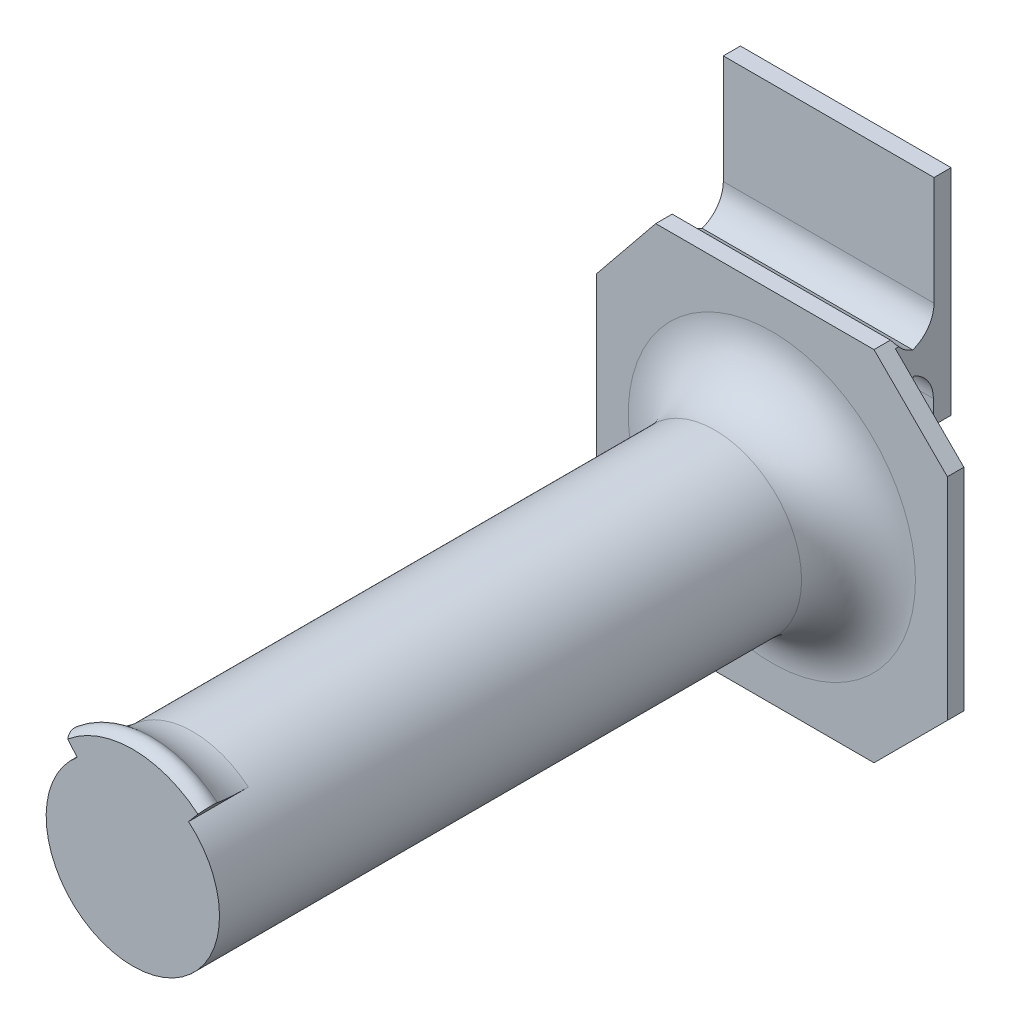
ISO-10303-21;
HEADER;
FILE_DESCRIPTION(('STEP AP214'),'2;1');
FILE_NAME('part.step','',(''),(''),'','','');
FILE_SCHEMA(('AUTOMOTIVE_DESIGN { 1 0 10303 214 1 1 1 1 }'));
ENDSEC;
DATA;
#1=APPLICATION_CONTEXT('core data for automotive mechanical design processes');
#2=APPLICATION_PROTOCOL_DEFINITION('international standard','automotive_design',2000,#1);
#3=PRODUCT_CONTEXT('',#1,'mechanical');
#4=PRODUCT('Part','Part','',(#3));
#5=PRODUCT_RELATED_PRODUCT_CATEGORY('part','',(#4));
#6=PRODUCT_DEFINITION_FORMATION('','',#4);
#7=PRODUCT_DEFINITION_CONTEXT('part definition',#1,'design');
#8=PRODUCT_DEFINITION('design','',#6,#7);
#9=PRODUCT_DEFINITION_SHAPE('','',#8);
#10=(LENGTH_UNIT() NAMED_UNIT(*) SI_UNIT(.MILLI.,.METRE.));
#11=(NAMED_UNIT(*) PLANE_ANGLE_UNIT() SI_UNIT($,.RADIAN.));
#12=(NAMED_UNIT(*) SI_UNIT($,.STERADIAN.) SOLID_ANGLE_UNIT());
#13=UNCERTAINTY_MEASURE_WITH_UNIT(LENGTH_MEASURE(1.E-05),#10,'distance_accuracy_value','');
#14=(GEOMETRIC_REPRESENTATION_CONTEXT(3) GLOBAL_UNCERTAINTY_ASSIGNED_CONTEXT((#13)) GLOBAL_UNIT_ASSIGNED_CONTEXT((#10,
#11,#12)) REPRESENTATION_CONTEXT('',''));
#15=CARTESIAN_POINT('',(0.,0.,0.));
#16=DIRECTION('',(0.,0.,1.));
#17=DIRECTION('',(1.,0.,0.));
#18=AXIS2_PLACEMENT_3D('',#15,#16,#17);
#19=CARTESIAN_POINT('',(0.,0.,0.));
#20=DIRECTION('',(0.,0.,1.));
#21=DIRECTION('',(1.,0.,0.));
#22=AXIS2_PLACEMENT_3D('',#19,#20,#21);
#23=PLANE('',#22);
#24=CARTESIAN_POINT('',(0.,0.,0.));
#25=DIRECTION('',(0.,0.,1.));
#26=DIRECTION('',(1.,0.,0.));
#27=AXIS2_PLACEMENT_3D('',#24,#25,#26);
#28=CIRCLE('',#27,22.7);
#29=CARTESIAN_POINT('',(22.7,0.,0.));
#30=VERTEX_POINT('',#29);
#31=EDGE_CURVE('E11',#30,#30,#28,.F.);
#32=ORIENTED_EDGE('',*,*,#31,.T.);
#33=EDGE_LOOP('',(#32));
#34=FACE_BOUND('',#33,.T.);
#35=DIRECTION('',(0.,-1.,0.));
#36=VECTOR('',#35,1.);
#37=CARTESIAN_POINT('',(27.75,28.280672501964,0.));
#38=LINE('',#37,#36);
#39=CARTESIAN_POINT('',(27.75,16.6806725019641,0.));
#40=VERTEX_POINT('',#39);
#41=CARTESIAN_POINT('',(27.75,-16.6806725019641,0.));
#42=VERTEX_POINT('',#41);
#43=EDGE_CURVE('E445',#40,#42,#38,.T.);
#44=ORIENTED_EDGE('',*,*,#43,.F.);
#45=DIRECTION('',(0.707106781186551,-0.707106781186544,0.));
#46=VECTOR('',#45,1.);
#47=CARTESIAN_POINT('',(16.15,28.280672501964,0.));
#48=LINE('',#47,#46);
#49=CARTESIAN_POINT('',(16.15,28.280672501964,0.));
#50=VERTEX_POINT('',#49);
#51=EDGE_CURVE('E392',#50,#40,#48,.T.);
#52=ORIENTED_EDGE('',*,*,#51,.F.);
#53=DIRECTION('',(1.,0.,0.));
#54=VECTOR('',#53,1.);
#55=CARTESIAN_POINT('',(-27.75,28.280672501964,0.));
#56=LINE('',#55,#54);
#57=CARTESIAN_POINT('',(-18.35,28.280672501964,0.));
#58=VERTEX_POINT('',#57);
#59=EDGE_CURVE('E433',#58,#50,#56,.T.);
#60=ORIENTED_EDGE('',*,*,#59,.F.);
#61=DIRECTION('',(0.629583498277007,0.77693282766098,0.));
#62=VECTOR('',#61,1.);
#63=CARTESIAN_POINT('',(-24.9098354997943,20.1855563532818,0.));
#64=LINE('',#63,#62);
#65=CARTESIAN_POINT('',(-27.75,16.6806725019641,0.));
#66=VERTEX_POINT('',#65);
#67=EDGE_CURVE('E419',#66,#58,#64,.T.);
#68=ORIENTED_EDGE('',*,*,#67,.F.);
#69=DIRECTION('',(0.,-1.,0.));
#70=VECTOR('',#69,1.);
#71=CARTESIAN_POINT('',(-27.75,28.280672501964,0.));
#72=LINE('',#71,#70);
#73=CARTESIAN_POINT('',(-27.75,-18.8806725019639,0.));
#74=VERTEX_POINT('',#73);
#75=EDGE_CURVE('E426',#66,#74,#72,.T.);
#76=ORIENTED_EDGE('',*,*,#75,.T.);
#77=DIRECTION('',(-0.707106781186545,0.70710678118655,0.));
#78=VECTOR('',#77,1.);
#79=CARTESIAN_POINT('',(-23.315336250982,-23.3153362509819,0.));
#80=LINE('',#79,#78);
#81=CARTESIAN_POINT('',(-18.35,-28.280672501964,0.));
#82=VERTEX_POINT('',#81);
#83=EDGE_CURVE('E400',#82,#74,#80,.T.);
#84=ORIENTED_EDGE('',*,*,#83,.F.);
#85=DIRECTION('',(1.,0.,0.));
#86=VECTOR('',#85,1.);
#87=CARTESIAN_POINT('',(-27.75,-28.280672501964,0.));
#88=LINE('',#87,#86);
#89=CARTESIAN_POINT('',(16.15,-28.280672501964,0.));
#90=VERTEX_POINT('',#89);
#91=EDGE_CURVE('E443',#82,#90,#88,.T.);
#92=ORIENTED_EDGE('',*,*,#91,.T.);
#93=DIRECTION('',(0.707106781186551,0.707106781186544,0.));
#94=VECTOR('',#93,1.);
#95=CARTESIAN_POINT('',(22.2153362509819,-22.2153362509821,0.));
#96=LINE('',#95,#94);
#97=EDGE_CURVE('E410',#90,#42,#96,.T.);
#98=ORIENTED_EDGE('',*,*,#97,.T.);
#99=EDGE_LOOP('',(#44,#52,#60,#68,#76,#84,#92,#98));
#100=FACE_BOUND('',#99,.T.);
#101=ADVANCED_FACE('F35',(#34,#100),#23,.T.);
#102=CARTESIAN_POINT('',(0.,0.,-2.6));
#103=DIRECTION('',(0.,0.,1.));
#104=DIRECTION('',(1.,0.,0.));
#105=AXIS2_PLACEMENT_3D('',#102,#103,#104);
#106=PLANE('',#105);
#107=DIRECTION('',(1.,0.,0.));
#108=VECTOR('',#107,1.);
#109=CARTESIAN_POINT('',(-27.75,28.280672501964,-2.6));
#110=LINE('',#109,#108);
#111=CARTESIAN_POINT('',(-18.35,28.280672501964,-2.6));
#112=VERTEX_POINT('',#111);
#113=CARTESIAN_POINT('',(-16.3666459952623,28.280672501964,-2.6));
#114=VERTEX_POINT('',#113);
#115=EDGE_CURVE('E438',#112,#114,#110,.T.);
#116=ORIENTED_EDGE('',*,*,#115,.T.);
#117=DIRECTION('',(0.,-1.,0.));
#118=VECTOR('',#117,1.);
#119=CARTESIAN_POINT('',(-16.3666459952623,25.680672501964,-2.6));
#120=LINE('',#119,#118);
#121=CARTESIAN_POINT('',(-16.3666459952623,17.680672501964,-2.6));
#122=VERTEX_POINT('',#121);
#123=EDGE_CURVE('E364',#114,#122,#120,.T.);
#124=ORIENTED_EDGE('',*,*,#123,.T.);
#125=DIRECTION('',(1.,0.,0.));
#126=VECTOR('',#125,1.);
#127=CARTESIAN_POINT('',(0.,17.680672501964,-2.6));
#128=LINE('',#127,#126);
#129=CARTESIAN_POINT('',(16.9333540047377,17.680672501964,-2.6));
#130=VERTEX_POINT('',#129);
#131=EDGE_CURVE('E260',#122,#130,#128,.T.);
#132=ORIENTED_EDGE('',*,*,#131,.T.);
#133=DIRECTION('',(0.,1.,0.));
#134=VECTOR('',#133,1.);
#135=CARTESIAN_POINT('',(16.9333540047377,22.680672501964,-2.6));
#136=LINE('',#135,#134);
#137=CARTESIAN_POINT('',(16.9333540047377,27.4973184972263,-2.6));
#138=VERTEX_POINT('',#137);
#139=EDGE_CURVE('E383',#130,#138,#136,.T.);
#140=ORIENTED_EDGE('',*,*,#139,.T.);
#141=DIRECTION('',(0.707106781186551,-0.707106781186544,0.));
#142=VECTOR('',#141,1.);
#143=CARTESIAN_POINT('',(16.15,28.280672501964,-2.6));
#144=LINE('',#143,#142);
#145=CARTESIAN_POINT('',(27.75,16.6806725019641,-2.6));
#146=VERTEX_POINT('',#145);
#147=EDGE_CURVE('E393',#138,#146,#144,.T.);
#148=ORIENTED_EDGE('',*,*,#147,.T.);
#149=DIRECTION('',(0.,-1.,0.));
#150=VECTOR('',#149,1.);
#151=CARTESIAN_POINT('',(27.75,28.280672501964,-2.6));
#152=LINE('',#151,#150);
#153=CARTESIAN_POINT('',(27.75,-16.6806725019641,-2.6));
#154=VERTEX_POINT('',#153);
#155=EDGE_CURVE('E435',#146,#154,#152,.T.);
#156=ORIENTED_EDGE('',*,*,#155,.T.);
#157=DIRECTION('',(0.707106781186551,0.707106781186544,0.));
#158=VECTOR('',#157,1.);
#159=CARTESIAN_POINT('',(22.2153362509819,-22.2153362509821,-2.6));
#160=LINE('',#159,#158);
#161=CARTESIAN_POINT('',(16.15,-28.280672501964,-2.6));
#162=VERTEX_POINT('',#161);
#163=EDGE_CURVE('E413',#162,#154,#160,.T.);
#164=ORIENTED_EDGE('',*,*,#163,.F.);
#165=DIRECTION('',(1.,0.,0.));
#166=VECTOR('',#165,1.);
#167=CARTESIAN_POINT('',(-27.75,-28.280672501964,-2.6));
#168=LINE('',#167,#166);
#169=CARTESIAN_POINT('',(-18.35,-28.280672501964,-2.6));
#170=VERTEX_POINT('',#169);
#171=EDGE_CURVE('E432',#170,#162,#168,.T.);
#172=ORIENTED_EDGE('',*,*,#171,.F.);
#173=DIRECTION('',(-0.707106781186545,0.70710678118655,0.));
#174=VECTOR('',#173,1.);
#175=CARTESIAN_POINT('',(-23.315336250982,-23.3153362509819,-2.6));
#176=LINE('',#175,#174);
#177=CARTESIAN_POINT('',(-27.75,-18.8806725019639,-2.6));
#178=VERTEX_POINT('',#177);
#179=EDGE_CURVE('E402',#170,#178,#176,.T.);
#180=ORIENTED_EDGE('',*,*,#179,.T.);
#181=DIRECTION('',(0.,-1.,0.));
#182=VECTOR('',#181,1.);
#183=CARTESIAN_POINT('',(-27.75,28.280672501964,-2.6));
#184=LINE('',#183,#182);
#185=CARTESIAN_POINT('',(-27.75,16.6806725019641,-2.6));
#186=VERTEX_POINT('',#185);
#187=EDGE_CURVE('E429',#186,#178,#184,.T.);
#188=ORIENTED_EDGE('',*,*,#187,.F.);
#189=DIRECTION('',(0.629583498277007,0.77693282766098,0.));
#190=VECTOR('',#189,1.);
#191=CARTESIAN_POINT('',(-24.9098354997943,20.1855563532818,-2.6));
#192=LINE('',#191,#190);
#193=EDGE_CURVE('E416',#186,#112,#192,.T.);
#194=ORIENTED_EDGE('',*,*,#193,.T.);
#195=EDGE_LOOP('',(#116,#124,#132,#140,#148,#156,#164,#172,#180,#188,#194));
#196=FACE_BOUND('',#195,.T.);
#197=ADVANCED_FACE('F305',(#196),#106,.F.);
#198=CARTESIAN_POINT('',(-27.75,28.280672501964,-2.6));
#199=DIRECTION('',(0.,-1.,0.));
#200=DIRECTION('',(1.,0.,0.));
#201=AXIS2_PLACEMENT_3D('',#198,#199,#200);
#202=PLANE('',#201);
#203=DIRECTION('',(0.,0.,-1.));
#204=VECTOR('',#203,1.);
#205=CARTESIAN_POINT('',(16.15,28.280672501964,0.));
#206=LINE('',#205,#204);
#207=CARTESIAN_POINT('',(16.15,28.280672501964,-2.6));
#208=VERTEX_POINT('',#207);
#209=EDGE_CURVE('E387',#50,#208,#206,.T.);
#210=ORIENTED_EDGE('',*,*,#209,.T.);
#211=EDGE_CURVE('E437',#114,#208,#110,.T.);
#212=ORIENTED_EDGE('',*,*,#211,.F.);
#213=ORIENTED_EDGE('',*,*,#115,.F.);
#214=DIRECTION('',(0.,0.,-1.));
#215=VECTOR('',#214,1.);
#216=CARTESIAN_POINT('',(-18.35,28.280672501964,0.));
#217=LINE('',#216,#215);
#218=EDGE_CURVE('E424',#58,#112,#217,.T.);
#219=ORIENTED_EDGE('',*,*,#218,.F.);
#220=ORIENTED_EDGE('',*,*,#59,.T.);
#221=EDGE_LOOP('',(#210,#212,#213,#219,#220));
#222=FACE_BOUND('',#221,.T.);
#223=ADVANCED_FACE('F311',(#222),#202,.F.);
#224=CARTESIAN_POINT('',(27.75,28.280672501964,-2.6));
#225=DIRECTION('',(-1.,0.,0.));
#226=DIRECTION('',(0.,-1.,0.));
#227=AXIS2_PLACEMENT_3D('',#224,#225,#226);
#228=PLANE('',#227);
#229=DIRECTION('',(0.,0.,-1.));
#230=VECTOR('',#229,1.);
#231=CARTESIAN_POINT('',(27.75,16.6806725019641,0.));
#232=LINE('',#231,#230);
#233=EDGE_CURVE('E385',#40,#146,#232,.T.);
#234=ORIENTED_EDGE('',*,*,#233,.F.);
#235=ORIENTED_EDGE('',*,*,#43,.T.);
#236=DIRECTION('',(0.,0.,-1.));
#237=VECTOR('',#236,1.);
#238=CARTESIAN_POINT('',(27.75,-16.6806725019641,0.));
#239=LINE('',#238,#237);
#240=EDGE_CURVE('E405',#42,#154,#239,.T.);
#241=ORIENTED_EDGE('',*,*,#240,.T.);
#242=ORIENTED_EDGE('',*,*,#155,.F.);
#243=EDGE_LOOP('',(#234,#235,#241,#242));
#244=FACE_BOUND('',#243,.T.);
#245=ADVANCED_FACE('F319',(#244),#228,.F.);
#246=CARTESIAN_POINT('',(-27.75,28.280672501964,-2.6));
#247=DIRECTION('',(-1.,0.,0.));
#248=DIRECTION('',(0.,-1.,0.));
#249=AXIS2_PLACEMENT_3D('',#246,#247,#248);
#250=PLANE('',#249);
#251=ORIENTED_EDGE('',*,*,#187,.T.);
#252=DIRECTION('',(0.,0.,-1.));
#253=VECTOR('',#252,1.);
#254=CARTESIAN_POINT('',(-27.75,-18.8806725019639,0.));
#255=LINE('',#254,#253);
#256=EDGE_CURVE('E395',#74,#178,#255,.T.);
#257=ORIENTED_EDGE('',*,*,#256,.F.);
#258=ORIENTED_EDGE('',*,*,#75,.F.);
#259=DIRECTION('',(0.,0.,-1.));
#260=VECTOR('',#259,1.);
#261=CARTESIAN_POINT('',(-27.75,16.6806725019641,0.));
#262=LINE('',#261,#260);
#263=EDGE_CURVE('E421',#66,#186,#262,.T.);
#264=ORIENTED_EDGE('',*,*,#263,.T.);
#265=EDGE_LOOP('',(#251,#257,#258,#264));
#266=FACE_BOUND('',#265,.T.);
#267=ADVANCED_FACE('F323',(#266),#250,.T.);
#268=CARTESIAN_POINT('',(-27.75,-28.280672501964,-2.6));
#269=DIRECTION('',(0.,-1.,0.));
#270=DIRECTION('',(1.,0.,0.));
#271=AXIS2_PLACEMENT_3D('',#268,#269,#270);
#272=PLANE('',#271);
#273=ORIENTED_EDGE('',*,*,#91,.F.);
#274=DIRECTION('',(0.,0.,-1.));
#275=VECTOR('',#274,1.);
#276=CARTESIAN_POINT('',(-18.35,-28.280672501964,0.));
#277=LINE('',#276,#275);
#278=EDGE_CURVE('E397',#82,#170,#277,.T.);
#279=ORIENTED_EDGE('',*,*,#278,.T.);
#280=ORIENTED_EDGE('',*,*,#171,.T.);
#281=DIRECTION('',(0.,0.,-1.));
#282=VECTOR('',#281,1.);
#283=CARTESIAN_POINT('',(16.15,-28.280672501964,0.));
#284=LINE('',#283,#282);
#285=EDGE_CURVE('E407',#90,#162,#284,.T.);
#286=ORIENTED_EDGE('',*,*,#285,.F.);
#287=EDGE_LOOP('',(#273,#279,#280,#286));
#288=FACE_BOUND('',#287,.T.);
#289=ADVANCED_FACE('F325',(#288),#272,.T.);
#290=CARTESIAN_POINT('',(0.,0.,101.));
#291=DIRECTION('',(0.,0.,-1.));
#292=DIRECTION('',(-1.,0.,0.));
#293=AXIS2_PLACEMENT_3D('',#290,#291,#292);
#294=CYLINDRICAL_SURFACE('',#293,13.7);
#295=CARTESIAN_POINT('',(0.,0.,9.00000000000001));
#296=DIRECTION('',(0.,0.,1.));
#297=DIRECTION('',(1.,0.,0.));
#298=AXIS2_PLACEMENT_3D('',#295,#296,#297);
#299=CIRCLE('',#298,13.7);
#300=CARTESIAN_POINT('',(13.7,0.,9.00000000000001));
#301=VERTEX_POINT('',#300);
#302=EDGE_CURVE('E43',#301,#301,#299,.T.);
#303=ORIENTED_EDGE('',*,*,#302,.T.);
#304=EDGE_LOOP('',(#303));
#305=FACE_BOUND('',#304,.T.);
#306=CARTESIAN_POINT('',(0.,0.,91.5396961789945));
#307=DIRECTION('',(0.,0.,1.));
#308=DIRECTION('',(1.,0.,0.));
#309=AXIS2_PLACEMENT_3D('',#306,#307,#308);
#310=CIRCLE('',#309,13.7);
#311=CARTESIAN_POINT('',(8.80619025270561,10.49480887073,91.5396961789945));
#312=VERTEX_POINT('',#311);
#313=CARTESIAN_POINT('',(-8.80619025270559,10.49480887073,91.5396961789945));
#314=VERTEX_POINT('',#313);
#315=EDGE_CURVE('E222',#312,#314,#310,.T.);
#316=ORIENTED_EDGE('',*,*,#315,.F.);
#317=DIRECTION('',(0.,0.,1.));
#318=VECTOR('',#317,1.);
#319=CARTESIAN_POINT('',(8.80619025270562,10.49480887073,101.));
#320=LINE('',#319,#318);
#321=CARTESIAN_POINT('',(8.80619025270562,10.49480887073,101.));
#322=VERTEX_POINT('',#321);
#323=EDGE_CURVE('E210',#312,#322,#320,.T.);
#324=ORIENTED_EDGE('',*,*,#323,.T.);
#325=CARTESIAN_POINT('',(0.,0.,101.));
#326=DIRECTION('',(0.,0.,1.));
#327=DIRECTION('',(1.,0.,0.));
#328=AXIS2_PLACEMENT_3D('',#325,#326,#327);
#329=CIRCLE('',#328,13.7);
#330=CARTESIAN_POINT('',(-8.8061902527056,10.49480887073,101.));
#331=VERTEX_POINT('',#330);
#332=EDGE_CURVE('E440',#331,#322,#329,.T.);
#333=ORIENTED_EDGE('',*,*,#332,.F.);
#334=DIRECTION('',(0.,0.,1.));
#335=VECTOR('',#334,1.);
#336=CARTESIAN_POINT('',(-8.80619025270559,10.49480887073,101.));
#337=LINE('',#336,#335);
#338=EDGE_CURVE('E204',#314,#331,#337,.T.);
#339=ORIENTED_EDGE('',*,*,#338,.F.);
#340=EDGE_LOOP('',(#316,#324,#333,#339));
#341=FACE_BOUND('',#340,.T.);
#342=ADVANCED_FACE('F293',(#305,#341),#294,.T.);
#343=CARTESIAN_POINT('',(0.,0.,101.));
#344=DIRECTION('',(0.,0.,1.));
#345=DIRECTION('',(1.,0.,0.));
#346=AXIS2_PLACEMENT_3D('',#343,#344,#345);
#347=PLANE('',#346);
#348=ORIENTED_EDGE('',*,*,#332,.T.);
#349=DIRECTION('',(0.642787609686541,0.766044443118977,0.));
#350=VECTOR('',#349,1.);
#351=CARTESIAN_POINT('',(8.80619025270562,10.49480887073,101.));
#352=LINE('',#351,#350);
#353=CARTESIAN_POINT('',(10.2846017549847,12.2567110899036,101.));
#354=VERTEX_POINT('',#353);
#355=EDGE_CURVE('E189',#322,#354,#352,.T.);
#356=ORIENTED_EDGE('',*,*,#355,.T.);
#357=CARTESIAN_POINT('',(0.,0.,101.));
#358=DIRECTION('',(0.,0.,1.));
#359=DIRECTION('',(1.,0.,0.));
#360=AXIS2_PLACEMENT_3D('',#357,#358,#359);
#361=CIRCLE('',#360,16.);
#362=CARTESIAN_POINT('',(-10.2846017549846,12.2567110899036,101.));
#363=VERTEX_POINT('',#362);
#364=EDGE_CURVE('E187',#354,#363,#361,.T.);
#365=ORIENTED_EDGE('',*,*,#364,.T.);
#366=DIRECTION('',(-0.642787609686541,0.766044443118977,0.));
#367=VECTOR('',#366,1.);
#368=CARTESIAN_POINT('',(-8.80619025270559,10.49480887073,101.));
#369=LINE('',#368,#367);
#370=EDGE_CURVE('E50',#331,#363,#369,.T.);
#371=ORIENTED_EDGE('',*,*,#370,.F.);
#372=EDGE_LOOP('',(#348,#356,#365,#371));
#373=FACE_BOUND('',#372,.T.);
#374=ADVANCED_FACE('F188',(#373),#347,.T.);
#375=CARTESIAN_POINT('',(-24.9098354997943,20.1855563532818,0.));
#376=DIRECTION('',(-0.77693282766098,0.629583498277007,0.));
#377=DIRECTION('',(-0.629583498277007,-0.77693282766098,0.));
#378=AXIS2_PLACEMENT_3D('',#375,#376,#377);
#379=PLANE('',#378);
#380=ORIENTED_EDGE('',*,*,#193,.F.);
#381=ORIENTED_EDGE('',*,*,#263,.F.);
#382=ORIENTED_EDGE('',*,*,#67,.T.);
#383=ORIENTED_EDGE('',*,*,#218,.T.);
#384=EDGE_LOOP('',(#380,#381,#382,#383));
#385=FACE_BOUND('',#384,.T.);
#386=ADVANCED_FACE('F334',(#385),#379,.T.);
#387=CARTESIAN_POINT('',(22.2153362509819,-22.2153362509821,0.));
#388=DIRECTION('',(-0.707106781186544,0.707106781186551,0.));
#389=DIRECTION('',(-0.707106781186551,-0.707106781186544,0.));
#390=AXIS2_PLACEMENT_3D('',#387,#388,#389);
#391=PLANE('',#390);
#392=ORIENTED_EDGE('',*,*,#163,.T.);
#393=ORIENTED_EDGE('',*,*,#240,.F.);
#394=ORIENTED_EDGE('',*,*,#97,.F.);
#395=ORIENTED_EDGE('',*,*,#285,.T.);
#396=EDGE_LOOP('',(#392,#393,#394,#395));
#397=FACE_BOUND('',#396,.T.);
#398=ADVANCED_FACE('F480',(#397),#391,.F.);
#399=CARTESIAN_POINT('',(-23.315336250982,-23.3153362509819,0.));
#400=DIRECTION('',(-0.70710678118655,-0.707106781186545,0.));
#401=DIRECTION('',(0.707106781186545,-0.70710678118655,0.));
#402=AXIS2_PLACEMENT_3D('',#399,#400,#401);
#403=PLANE('',#402);
#404=ORIENTED_EDGE('',*,*,#179,.F.);
#405=ORIENTED_EDGE('',*,*,#278,.F.);
#406=ORIENTED_EDGE('',*,*,#83,.T.);
#407=ORIENTED_EDGE('',*,*,#256,.T.);
#408=EDGE_LOOP('',(#404,#405,#406,#407));
#409=FACE_BOUND('',#408,.T.);
#410=ADVANCED_FACE('F493',(#409),#403,.T.);
#411=CARTESIAN_POINT('',(16.15,28.280672501964,0.));
#412=DIRECTION('',(0.707106781186544,0.707106781186551,0.));
#413=DIRECTION('',(-0.707106781186551,0.707106781186544,0.));
#414=AXIS2_PLACEMENT_3D('',#411,#412,#413);
#415=PLANE('',#414);
#416=ORIENTED_EDGE('',*,*,#147,.F.);
#417=DIRECTION('',(0.,0.,-1.));
#418=VECTOR('',#417,1.);
#419=CARTESIAN_POINT('',(16.9333540047377,27.4973184972263,0.));
#420=LINE('',#419,#418);
#421=CARTESIAN_POINT('',(16.9333540047377,27.4973184972263,-3.13066386400961));
#422=VERTEX_POINT('',#421);
#423=EDGE_CURVE('E285',#138,#422,#420,.T.);
#424=ORIENTED_EDGE('',*,*,#423,.T.);
#425=CARTESIAN_POINT('',(13.75,30.680672501964,-6.98634243989226));
#426=DIRECTION('',(0.707106781186544,0.707106781186551,0.));
#427=DIRECTION('',(0.707106781186551,-0.707106781186544,0.));
#428=AXIS2_PLACEMENT_3D('',#425,#426,#427);
#429=ELLIPSE('',#428,7.07106781186551,5.);
#430=EDGE_CURVE('E266',#422,#208,#429,.F.);
#431=ORIENTED_EDGE('',*,*,#430,.T.);
#432=ORIENTED_EDGE('',*,*,#209,.F.);
#433=ORIENTED_EDGE('',*,*,#51,.T.);
#434=ORIENTED_EDGE('',*,*,#233,.T.);
#435=EDGE_LOOP('',(#416,#424,#431,#432,#433,#434));
#436=FACE_BOUND('',#435,.T.);
#437=ADVANCED_FACE('F473',(#436),#415,.T.);
#438=CARTESIAN_POINT('',(-16.3666459952623,25.680672501964,-8.6));
#439=DIRECTION('',(-1.,0.,0.));
#440=DIRECTION('',(0.,0.,1.));
#441=AXIS2_PLACEMENT_3D('',#438,#439,#440);
#442=PLANE('',#441);
#443=ORIENTED_EDGE('',*,*,#123,.F.);
#444=CARTESIAN_POINT('',(-16.3666459952623,30.680672501964,-6.98634243989226));
#445=DIRECTION('',(-1.,0.,0.));
#446=DIRECTION('',(0.,0.,1.));
#447=AXIS2_PLACEMENT_3D('',#444,#445,#446);
#448=CIRCLE('',#447,5.);
#449=CARTESIAN_POINT('',(-16.3666459952623,25.9583861550828,-5.34317121994613));
#450=VERTEX_POINT('',#449);
#451=EDGE_CURVE('E269',#114,#450,#448,.F.);
#452=ORIENTED_EDGE('',*,*,#451,.T.);
#453=CARTESIAN_POINT('',(-16.3666459952623,30.680672501964,-3.7));
#454=DIRECTION('',(-1.,0.,0.));
#455=DIRECTION('',(0.,0.,1.));
#456=AXIS2_PLACEMENT_3D('',#453,#454,#455);
#457=CIRCLE('',#456,5.);
#458=CARTESIAN_POINT('',(-16.3666459952623,30.680672501964,-8.7));
#459=VERTEX_POINT('',#458);
#460=EDGE_CURVE('E283',#450,#459,#457,.F.);
#461=ORIENTED_EDGE('',*,*,#460,.T.);
#462=DIRECTION('',(0.,-1.,0.));
#463=VECTOR('',#462,1.);
#464=CARTESIAN_POINT('',(-16.3666459952623,47.880672501964,-8.7));
#465=LINE('',#464,#463);
#466=CARTESIAN_POINT('',(-16.3666459952623,47.880672501964,-8.7));
#467=VERTEX_POINT('',#466);
#468=EDGE_CURVE('E240',#467,#459,#465,.T.);
#469=ORIENTED_EDGE('',*,*,#468,.F.);
#470=DIRECTION('',(0.,0.,1.));
#471=VECTOR('',#470,1.);
#472=CARTESIAN_POINT('',(-16.3666459952623,47.880672501964,-11.4));
#473=LINE('',#472,#471);
#474=CARTESIAN_POINT('',(-16.3666459952623,47.880672501964,-11.4));
#475=VERTEX_POINT('',#474);
#476=EDGE_CURVE('E225',#475,#467,#473,.T.);
#477=ORIENTED_EDGE('',*,*,#476,.F.);
#478=DIRECTION('',(0.,1.,0.));
#479=VECTOR('',#478,1.);
#480=CARTESIAN_POINT('',(-16.3666459952623,25.680672501964,-11.4));
#481=LINE('',#480,#479);
#482=CARTESIAN_POINT('',(-16.3666459952623,13.980672501964,-11.4));
#483=VERTEX_POINT('',#482);
#484=EDGE_CURVE('E250',#483,#475,#481,.T.);
#485=ORIENTED_EDGE('',*,*,#484,.F.);
#486=DIRECTION('',(0.,0.,1.));
#487=VECTOR('',#486,1.);
#488=CARTESIAN_POINT('',(-16.3666459952623,13.980672501964,-11.4));
#489=LINE('',#488,#487);
#490=CARTESIAN_POINT('',(-16.3666459952623,13.980672501964,-8.6));
#491=VERTEX_POINT('',#490);
#492=EDGE_CURVE('E252',#483,#491,#489,.T.);
#493=ORIENTED_EDGE('',*,*,#492,.T.);
#494=DIRECTION('',(0.,1.,0.));
#495=VECTOR('',#494,1.);
#496=CARTESIAN_POINT('',(-16.3666459952623,25.680672501964,-8.6));
#497=LINE('',#496,#495);
#498=CARTESIAN_POINT('',(-16.3666459952623,17.680672501964,-8.6));
#499=VERTEX_POINT('',#498);
#500=EDGE_CURVE('E248',#491,#499,#497,.T.);
#501=ORIENTED_EDGE('',*,*,#500,.T.);
#502=CARTESIAN_POINT('',(-16.3666459952623,17.680672501964,-3.6));
#503=DIRECTION('',(-1.,0.,0.));
#504=DIRECTION('',(0.,0.,1.));
#505=AXIS2_PLACEMENT_3D('',#502,#503,#504);
#506=CIRCLE('',#505,5.);
#507=CARTESIAN_POINT('',(-16.3666459952623,22.2632481969198,-5.6));
#508=VERTEX_POINT('',#507);
#509=EDGE_CURVE('E279',#499,#508,#506,.F.);
#510=ORIENTED_EDGE('',*,*,#509,.T.);
#511=CARTESIAN_POINT('',(-16.3666459952623,17.680672501964,-7.6));
#512=DIRECTION('',(-1.,0.,0.));
#513=DIRECTION('',(0.,0.,1.));
#514=AXIS2_PLACEMENT_3D('',#511,#512,#513);
#515=CIRCLE('',#514,5.);
#516=EDGE_CURVE('E274',#508,#122,#515,.F.);
#517=ORIENTED_EDGE('',*,*,#516,.T.);
#518=EDGE_LOOP('',(#443,#452,#461,#469,#477,#485,#493,#501,#510,#517));
#519=FACE_BOUND('',#518,.T.);
#520=ADVANCED_FACE('F363',(#519),#442,.T.);
#521=CARTESIAN_POINT('',(16.9333540047377,22.680672501964,-8.6));
#522=DIRECTION('',(1.,0.,0.));
#523=DIRECTION('',(0.,0.,-1.));
#524=AXIS2_PLACEMENT_3D('',#521,#522,#523);
#525=PLANE('',#524);
#526=ORIENTED_EDGE('',*,*,#139,.F.);
#527=CARTESIAN_POINT('',(16.9333540047377,17.680672501964,-7.6));
#528=DIRECTION('',(1.,0.,0.));
#529=DIRECTION('',(0.,0.,-1.));
#530=AXIS2_PLACEMENT_3D('',#527,#528,#529);
#531=CIRCLE('',#530,5.);
#532=CARTESIAN_POINT('',(16.9333540047377,22.2632481969198,-5.6));
#533=VERTEX_POINT('',#532);
#534=EDGE_CURVE('E272',#130,#533,#531,.F.);
#535=ORIENTED_EDGE('',*,*,#534,.T.);
#536=CARTESIAN_POINT('',(16.9333540047377,17.680672501964,-3.6));
#537=DIRECTION('',(1.,0.,0.));
#538=DIRECTION('',(0.,0.,-1.));
#539=AXIS2_PLACEMENT_3D('',#536,#537,#538);
#540=CIRCLE('',#539,5.);
#541=CARTESIAN_POINT('',(16.9333540047377,17.680672501964,-8.6));
#542=VERTEX_POINT('',#541);
#543=EDGE_CURVE('E277',#533,#542,#540,.F.);
#544=ORIENTED_EDGE('',*,*,#543,.T.);
#545=DIRECTION('',(0.,-1.,0.));
#546=VECTOR('',#545,1.);
#547=CARTESIAN_POINT('',(16.9333540047377,25.680672501964,-8.6));
#548=LINE('',#547,#546);
#549=CARTESIAN_POINT('',(16.9333540047377,13.980672501964,-8.6));
#550=VERTEX_POINT('',#549);
#551=EDGE_CURVE('E243',#542,#550,#548,.T.);
#552=ORIENTED_EDGE('',*,*,#551,.T.);
#553=DIRECTION('',(0.,0.,1.));
#554=VECTOR('',#553,1.);
#555=CARTESIAN_POINT('',(16.9333540047377,13.980672501964,-11.4));
#556=LINE('',#555,#554);
#557=CARTESIAN_POINT('',(16.9333540047377,13.980672501964,-11.4));
#558=VERTEX_POINT('',#557);
#559=EDGE_CURVE('E376',#558,#550,#556,.T.);
#560=ORIENTED_EDGE('',*,*,#559,.F.);
#561=DIRECTION('',(0.,-1.,0.));
#562=VECTOR('',#561,1.);
#563=CARTESIAN_POINT('',(16.9333540047377,25.680672501964,-11.4));
#564=LINE('',#563,#562);
#565=CARTESIAN_POINT('',(16.9333540047377,47.880672501964,-11.4));
#566=VERTEX_POINT('',#565);
#567=EDGE_CURVE('E244',#566,#558,#564,.T.);
#568=ORIENTED_EDGE('',*,*,#567,.F.);
#569=DIRECTION('',(0.,0.,-1.));
#570=VECTOR('',#569,1.);
#571=CARTESIAN_POINT('',(16.9333540047377,47.880672501964,-11.4));
#572=LINE('',#571,#570);
#573=CARTESIAN_POINT('',(16.9333540047377,47.880672501964,-8.7));
#574=VERTEX_POINT('',#573);
#575=EDGE_CURVE('E231',#574,#566,#572,.T.);
#576=ORIENTED_EDGE('',*,*,#575,.F.);
#577=DIRECTION('',(0.,-1.,0.));
#578=VECTOR('',#577,1.);
#579=CARTESIAN_POINT('',(16.9333540047377,47.880672501964,-8.7));
#580=LINE('',#579,#578);
#581=CARTESIAN_POINT('',(16.9333540047377,30.680672501964,-8.7));
#582=VERTEX_POINT('',#581);
#583=EDGE_CURVE('E237',#574,#582,#580,.T.);
#584=ORIENTED_EDGE('',*,*,#583,.T.);
#585=CARTESIAN_POINT('',(16.9333540047377,30.680672501964,-3.7));
#586=DIRECTION('',(1.,0.,0.));
#587=DIRECTION('',(0.,0.,-1.));
#588=AXIS2_PLACEMENT_3D('',#585,#586,#587);
#589=CIRCLE('',#588,5.);
#590=CARTESIAN_POINT('',(16.9333540047377,25.9583861550828,-5.34317121994613));
#591=VERTEX_POINT('',#590);
#592=EDGE_CURVE('E281',#582,#591,#589,.F.);
#593=ORIENTED_EDGE('',*,*,#592,.T.);
#594=CARTESIAN_POINT('',(16.9333540047377,30.680672501964,-6.98634243989226));
#595=DIRECTION('',(1.,0.,0.));
#596=DIRECTION('',(0.,0.,-1.));
#597=AXIS2_PLACEMENT_3D('',#594,#595,#596);
#598=CIRCLE('',#597,5.);
#599=EDGE_CURVE('E58',#591,#422,#598,.F.);
#600=ORIENTED_EDGE('',*,*,#599,.T.);
#601=ORIENTED_EDGE('',*,*,#423,.F.);
#602=EDGE_LOOP('',(#526,#535,#544,#552,#560,#568,#576,#584,#593,#600,#601));
#603=FACE_BOUND('',#602,.T.);
#604=ADVANCED_FACE('F462',(#603),#525,.T.);
#605=CARTESIAN_POINT('',(16.9333540047377,13.980672501964,-11.4));
#606=DIRECTION('',(0.,1.,0.));
#607=DIRECTION('',(0.,0.,1.));
#608=AXIS2_PLACEMENT_3D('',#605,#606,#607);
#609=PLANE('',#608);
#610=DIRECTION('',(-1.,0.,0.));
#611=VECTOR('',#610,1.);
#612=CARTESIAN_POINT('',(16.9333540047377,13.980672501964,-8.6));
#613=LINE('',#612,#611);
#614=EDGE_CURVE('E255',#550,#491,#613,.T.);
#615=ORIENTED_EDGE('',*,*,#614,.T.);
#616=ORIENTED_EDGE('',*,*,#492,.F.);
#617=DIRECTION('',(-1.,0.,0.));
#618=VECTOR('',#617,1.);
#619=CARTESIAN_POINT('',(16.9333540047377,13.980672501964,-11.4));
#620=LINE('',#619,#618);
#621=EDGE_CURVE('E247',#558,#483,#620,.T.);
#622=ORIENTED_EDGE('',*,*,#621,.F.);
#623=ORIENTED_EDGE('',*,*,#559,.T.);
#624=EDGE_LOOP('',(#615,#616,#622,#623));
#625=FACE_BOUND('',#624,.T.);
#626=ADVANCED_FACE('F468',(#625),#609,.F.);
#627=CARTESIAN_POINT('',(0.,0.,-11.4));
#628=DIRECTION('',(0.,0.,-1.));
#629=DIRECTION('',(-1.,0.,0.));
#630=AXIS2_PLACEMENT_3D('',#627,#628,#629);
#631=PLANE('',#630);
#632=ORIENTED_EDGE('',*,*,#567,.T.);
#633=ORIENTED_EDGE('',*,*,#621,.T.);
#634=ORIENTED_EDGE('',*,*,#484,.T.);
#635=DIRECTION('',(-1.,0.,0.));
#636=VECTOR('',#635,1.);
#637=CARTESIAN_POINT('',(-16.3666459952623,47.880672501964,-11.4));
#638=LINE('',#637,#636);
#639=EDGE_CURVE('E234',#566,#475,#638,.T.);
#640=ORIENTED_EDGE('',*,*,#639,.F.);
#641=EDGE_LOOP('',(#632,#633,#634,#640));
#642=FACE_BOUND('',#641,.T.);
#643=ADVANCED_FACE('F467',(#642),#631,.T.);
#644=CARTESIAN_POINT('',(0.,0.,-8.6));
#645=DIRECTION('',(0.,0.,-1.));
#646=DIRECTION('',(-1.,0.,0.));
#647=AXIS2_PLACEMENT_3D('',#644,#645,#646);
#648=PLANE('',#647);
#649=ORIENTED_EDGE('',*,*,#551,.F.);
#650=DIRECTION('',(1.,0.,0.));
#651=VECTOR('',#650,1.);
#652=CARTESIAN_POINT('',(0.,17.680672501964,-8.6));
#653=LINE('',#652,#651);
#654=EDGE_CURVE('E262',#542,#499,#653,.F.);
#655=ORIENTED_EDGE('',*,*,#654,.T.);
#656=ORIENTED_EDGE('',*,*,#500,.F.);
#657=ORIENTED_EDGE('',*,*,#614,.F.);
#658=EDGE_LOOP('',(#649,#655,#656,#657));
#659=FACE_BOUND('',#658,.T.);
#660=ADVANCED_FACE('F470',(#659),#648,.F.);
#661=CARTESIAN_POINT('',(-16.3666459952623,47.880672501964,-8.7));
#662=DIRECTION('',(0.,0.,-1.));
#663=DIRECTION('',(-1.,0.,0.));
#664=AXIS2_PLACEMENT_3D('',#661,#662,#663);
#665=PLANE('',#664);
#666=ORIENTED_EDGE('',*,*,#468,.T.);
#667=DIRECTION('',(1.,0.,0.));
#668=VECTOR('',#667,1.);
#669=CARTESIAN_POINT('',(-16.3666459952623,30.680672501964,-8.7));
#670=LINE('',#669,#668);
#671=EDGE_CURVE('E264',#459,#582,#670,.T.);
#672=ORIENTED_EDGE('',*,*,#671,.T.);
#673=ORIENTED_EDGE('',*,*,#583,.F.);
#674=DIRECTION('',(1.,0.,0.));
#675=VECTOR('',#674,1.);
#676=CARTESIAN_POINT('',(-16.3666459952623,47.880672501964,-8.7));
#677=LINE('',#676,#675);
#678=EDGE_CURVE('E228',#467,#574,#677,.T.);
#679=ORIENTED_EDGE('',*,*,#678,.F.);
#680=EDGE_LOOP('',(#666,#672,#673,#679));
#681=FACE_BOUND('',#680,.T.);
#682=ADVANCED_FACE('F460',(#681),#665,.F.);
#683=CARTESIAN_POINT('',(0.,47.880672501964,0.));
#684=DIRECTION('',(0.,1.,0.));
#685=DIRECTION('',(0.,0.,1.));
#686=AXIS2_PLACEMENT_3D('',#683,#684,#685);
#687=PLANE('',#686);
#688=ORIENTED_EDGE('',*,*,#476,.T.);
#689=ORIENTED_EDGE('',*,*,#678,.T.);
#690=ORIENTED_EDGE('',*,*,#575,.T.);
#691=ORIENTED_EDGE('',*,*,#639,.T.);
#692=EDGE_LOOP('',(#688,#689,#690,#691));
#693=FACE_BOUND('',#692,.T.);
#694=ADVANCED_FACE('F345',(#693),#687,.T.);
#695=CARTESIAN_POINT('',(-16.3666459952623,30.680672501964,-3.7));
#696=DIRECTION('',(1.,0.,0.));
#697=DIRECTION('',(0.,0.,-1.));
#698=AXIS2_PLACEMENT_3D('',#695,#696,#697);
#699=CYLINDRICAL_SURFACE('',#698,5.);
#700=DIRECTION('',(1.,0.,0.));
#701=VECTOR('',#700,1.);
#702=CARTESIAN_POINT('',(0.283354004737727,25.9583861550828,-5.34317121994613));
#703=LINE('',#702,#701);
#704=EDGE_CURVE('E229',#591,#450,#703,.F.);
#705=ORIENTED_EDGE('',*,*,#704,.F.);
#706=ORIENTED_EDGE('',*,*,#592,.F.);
#707=ORIENTED_EDGE('',*,*,#671,.F.);
#708=ORIENTED_EDGE('',*,*,#460,.F.);
#709=EDGE_LOOP('',(#705,#706,#707,#708));
#710=FACE_BOUND('',#709,.T.);
#711=ADVANCED_FACE('F341',(#710),#699,.F.);
#712=CARTESIAN_POINT('',(0.,30.680672501964,-6.98634243989226));
#713=DIRECTION('',(1.,0.,0.));
#714=DIRECTION('',(0.,1.,0.));
#715=AXIS2_PLACEMENT_3D('',#712,#713,#714);
#716=CYLINDRICAL_SURFACE('',#715,5.);
#717=ORIENTED_EDGE('',*,*,#599,.F.);
#718=ORIENTED_EDGE('',*,*,#704,.T.);
#719=ORIENTED_EDGE('',*,*,#451,.F.);
#720=ORIENTED_EDGE('',*,*,#211,.T.);
#721=ORIENTED_EDGE('',*,*,#430,.F.);
#722=EDGE_LOOP('',(#717,#718,#719,#720,#721));
#723=FACE_BOUND('',#722,.T.);
#724=ADVANCED_FACE('F337',(#723),#716,.F.);
#725=CARTESIAN_POINT('',(-16.3666459952623,17.680672501964,-3.6));
#726=DIRECTION('',(1.,0.,0.));
#727=DIRECTION('',(0.,1.,0.));
#728=AXIS2_PLACEMENT_3D('',#725,#726,#727);
#729=CYLINDRICAL_SURFACE('',#728,5.);
#730=DIRECTION('',(1.,0.,0.));
#731=VECTOR('',#730,1.);
#732=CARTESIAN_POINT('',(0.283354004737728,22.2632481969198,-5.6));
#733=LINE('',#732,#731);
#734=EDGE_CURVE('E194',#508,#533,#733,.T.);
#735=ORIENTED_EDGE('',*,*,#734,.F.);
#736=ORIENTED_EDGE('',*,*,#509,.F.);
#737=ORIENTED_EDGE('',*,*,#654,.F.);
#738=ORIENTED_EDGE('',*,*,#543,.F.);
#739=EDGE_LOOP('',(#735,#736,#737,#738));
#740=FACE_BOUND('',#739,.T.);
#741=ADVANCED_FACE('F340',(#740),#729,.F.);
#742=CARTESIAN_POINT('',(0.,17.680672501964,-7.6));
#743=DIRECTION('',(1.,0.,0.));
#744=DIRECTION('',(0.,1.,0.));
#745=AXIS2_PLACEMENT_3D('',#742,#743,#744);
#746=CYLINDRICAL_SURFACE('',#745,5.);
#747=ORIENTED_EDGE('',*,*,#516,.F.);
#748=ORIENTED_EDGE('',*,*,#734,.T.);
#749=ORIENTED_EDGE('',*,*,#534,.F.);
#750=ORIENTED_EDGE('',*,*,#131,.F.);
#751=EDGE_LOOP('',(#747,#748,#749,#750));
#752=FACE_BOUND('',#751,.T.);
#753=ADVANCED_FACE('F347',(#752),#746,.F.);
#754=CARTESIAN_POINT('',(0.,0.,99.4136051444712));
#755=DIRECTION('',(0.,0.,1.));
#756=DIRECTION('',(1.,0.,0.));
#757=AXIS2_PLACEMENT_3D('',#754,#755,#756);
#758=TOROIDAL_SURFACE('',#757,14.6198643222511,2.10271803308092);
#759=CARTESIAN_POINT('',(0.,0.,98.0263076397705));
#760=DIRECTION('',(0.,0.,1.));
#761=DIRECTION('',(1.,0.,0.));
#762=AXIS2_PLACEMENT_3D('',#759,#760,#761);
#763=CIRCLE('',#762,16.2);
#764=CARTESIAN_POINT('',(10.413159276922,12.4099199785274,98.0263076397705));
#765=VERTEX_POINT('',#764);
#766=CARTESIAN_POINT('',(-10.4131592769219,12.4099199785274,98.0263076397705));
#767=VERTEX_POINT('',#766);
#768=EDGE_CURVE('E195',#765,#767,#763,.T.);
#769=ORIENTED_EDGE('',*,*,#768,.T.);
#770=CARTESIAN_POINT('',(-9.39746764164131,11.1994658232138,99.4136051444712));
#771=DIRECTION('',(-0.766044443118977,-0.642787609686541,0.));
#772=DIRECTION('',(0.,0.,1.));
#773=AXIS2_PLACEMENT_3D('',#770,#771,#772);
#774=CIRCLE('',#773,2.10271803308092);
#775=EDGE_CURVE('E201',#363,#767,#774,.T.);
#776=ORIENTED_EDGE('',*,*,#775,.F.);
#777=ORIENTED_EDGE('',*,*,#364,.F.);
#778=CARTESIAN_POINT('',(9.39746764164133,11.1994658232138,99.4136051444712));
#779=DIRECTION('',(-0.766044443118977,0.642787609686541,0.));
#780=DIRECTION('',(0.,0.,1.));
#781=AXIS2_PLACEMENT_3D('',#778,#779,#780);
#782=CIRCLE('',#781,2.10271803308092);
#783=EDGE_CURVE('E217',#354,#765,#782,.T.);
#784=ORIENTED_EDGE('',*,*,#783,.T.);
#785=EDGE_LOOP('',(#769,#776,#777,#784));
#786=FACE_BOUND('',#785,.T.);
#787=ADVANCED_FACE('F207',(#786),#758,.T.);
#788=CARTESIAN_POINT('',(0.,0.,90.5639847930217));
#789=DIRECTION('',(0.,0.,1.));
#790=DIRECTION('',(1.,0.,0.));
#791=AXIS2_PLACEMENT_3D('',#788,#789,#790);
#792=TOROIDAL_SURFACE('',#791,25.8968499120784,12.2358146637845);
#793=CARTESIAN_POINT('',(16.646174253396,19.8381379694338,90.5639847930217));
#794=DIRECTION('',(0.766044443118977,-0.642787609686541,0.));
#795=DIRECTION('',(0.,0.,-1.));
#796=AXIS2_PLACEMENT_3D('',#793,#794,#795);
#797=CIRCLE('',#796,12.2358146637845);
#798=EDGE_CURVE('E219',#765,#312,#797,.T.);
#799=ORIENTED_EDGE('',*,*,#798,.T.);
#800=ORIENTED_EDGE('',*,*,#315,.T.);
#801=CARTESIAN_POINT('',(-16.6461742533959,19.8381379694338,90.5639847930217));
#802=DIRECTION('',(0.766044443118977,0.642787609686541,0.));
#803=DIRECTION('',(0.,0.,-1.));
#804=AXIS2_PLACEMENT_3D('',#801,#802,#803);
#805=CIRCLE('',#804,12.2358146637845);
#806=EDGE_CURVE('E208',#767,#314,#805,.T.);
#807=ORIENTED_EDGE('',*,*,#806,.F.);
#808=ORIENTED_EDGE('',*,*,#768,.F.);
#809=EDGE_LOOP('',(#799,#800,#807,#808));
#810=FACE_BOUND('',#809,.T.);
#811=ADVANCED_FACE('F632',(#810),#792,.F.);
#812=CARTESIAN_POINT('',(16.646174253396,19.8381379694338,90.5639847930217));
#813=DIRECTION('',(0.766044443118977,-0.642787609686541,0.));
#814=DIRECTION('',(0.,0.,-1.));
#815=AXIS2_PLACEMENT_3D('',#812,#813,#814);
#816=PLANE('',#815);
#817=ORIENTED_EDGE('',*,*,#323,.F.);
#818=ORIENTED_EDGE('',*,*,#798,.F.);
#819=ORIENTED_EDGE('',*,*,#783,.F.);
#820=ORIENTED_EDGE('',*,*,#355,.F.);
#821=EDGE_LOOP('',(#817,#818,#819,#820));
#822=FACE_BOUND('',#821,.T.);
#823=ADVANCED_FACE('F301',(#822),#816,.T.);
#824=CARTESIAN_POINT('',(-16.6461742533959,19.8381379694338,90.5639847930217));
#825=DIRECTION('',(0.766044443118977,0.642787609686541,0.));
#826=DIRECTION('',(0.,0.,-1.));
#827=AXIS2_PLACEMENT_3D('',#824,#825,#826);
#828=PLANE('',#827);
#829=ORIENTED_EDGE('',*,*,#338,.T.);
#830=ORIENTED_EDGE('',*,*,#370,.T.);
#831=ORIENTED_EDGE('',*,*,#775,.T.);
#832=ORIENTED_EDGE('',*,*,#806,.T.);
#833=EDGE_LOOP('',(#829,#830,#831,#832));
#834=FACE_BOUND('',#833,.T.);
#835=ADVANCED_FACE('F199',(#834),#828,.F.);
#836=CARTESIAN_POINT('',(0.,0.,8.99999999999999));
#837=DIRECTION('',(0.,0.,1.));
#838=DIRECTION('',(1.,0.,0.));
#839=AXIS2_PLACEMENT_3D('',#836,#837,#838);
#840=TOROIDAL_SURFACE('',#839,22.7,9.);
#841=ORIENTED_EDGE('',*,*,#31,.F.);
#842=EDGE_LOOP('',(#841));
#843=FACE_BOUND('',#842,.T.);
#844=ORIENTED_EDGE('',*,*,#302,.F.);
#845=EDGE_LOOP('',(#844));
#846=FACE_BOUND('',#845,.T.);
#847=ADVANCED_FACE('F37',(#843,#846),#840,.F.);
#848=CLOSED_SHELL('',(#101,#197,#223,#245,#267,#289,#342,#374,#386,#398,#410,#437,#520,#604,
#626,#643,#660,#682,#694,#711,#724,#741,#753,#787,#811,#823,#835,#847));
#849=MANIFOLD_SOLID_BREP('B2',#848);
#850=ADVANCED_BREP_SHAPE_REPRESENTATION('',(#18,#849),#14);
#851=SHAPE_DEFINITION_REPRESENTATION(#9,#850);
ENDSEC;
END-ISO-10303-21;
